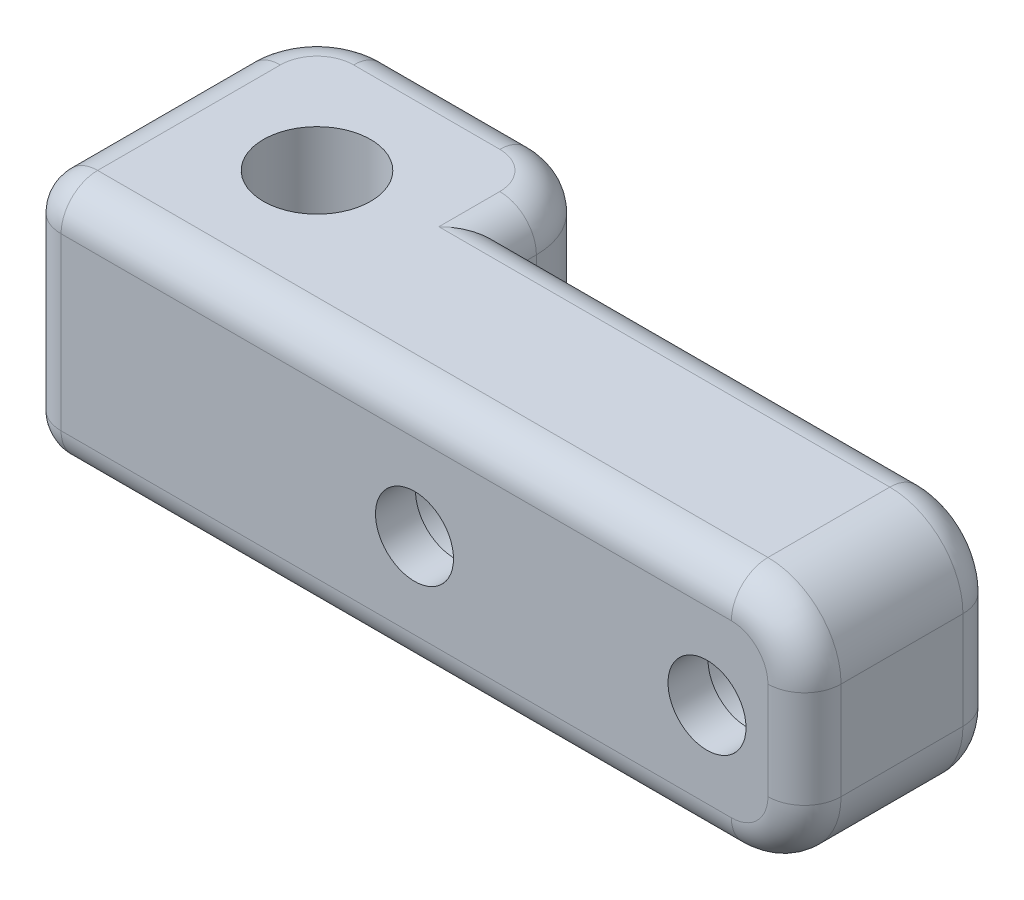
ISO-10303-21;
HEADER;
FILE_DESCRIPTION(('STEP AP214'),'2;1');
FILE_NAME('part.step','',(''),(''),'','','');
FILE_SCHEMA(('AUTOMOTIVE_DESIGN { 1 0 10303 214 1 1 1 1 }'));
ENDSEC;
DATA;
#1=APPLICATION_CONTEXT('core data for automotive mechanical design processes');
#2=APPLICATION_PROTOCOL_DEFINITION('international standard','automotive_design',2000,#1);
#3=PRODUCT_CONTEXT('',#1,'mechanical');
#4=PRODUCT('Part','Part','',(#3));
#5=PRODUCT_RELATED_PRODUCT_CATEGORY('part','',(#4));
#6=PRODUCT_DEFINITION_FORMATION('','',#4);
#7=PRODUCT_DEFINITION_CONTEXT('part definition',#1,'design');
#8=PRODUCT_DEFINITION('design','',#6,#7);
#9=PRODUCT_DEFINITION_SHAPE('','',#8);
#10=(LENGTH_UNIT() NAMED_UNIT(*) SI_UNIT(.MILLI.,.METRE.));
#11=(NAMED_UNIT(*) PLANE_ANGLE_UNIT() SI_UNIT($,.RADIAN.));
#12=(NAMED_UNIT(*) SI_UNIT($,.STERADIAN.) SOLID_ANGLE_UNIT());
#13=UNCERTAINTY_MEASURE_WITH_UNIT(LENGTH_MEASURE(1.E-05),#10,'distance_accuracy_value','');
#14=(GEOMETRIC_REPRESENTATION_CONTEXT(3) GLOBAL_UNCERTAINTY_ASSIGNED_CONTEXT((#13)) GLOBAL_UNIT_ASSIGNED_CONTEXT((#10,
#11,#12)) REPRESENTATION_CONTEXT('',''));
#15=CARTESIAN_POINT('',(0.,0.,0.));
#16=DIRECTION('',(0.,0.,1.));
#17=DIRECTION('',(1.,0.,0.));
#18=AXIS2_PLACEMENT_3D('',#15,#16,#17);
#19=CARTESIAN_POINT('',(12.,10.,0.));
#20=DIRECTION('',(-1.,0.,0.));
#21=DIRECTION('',(0.,0.,1.));
#22=AXIS2_PLACEMENT_3D('',#19,#20,#21);
#23=PLANE('',#22);
#24=DIRECTION('',(0.,1.,0.));
#25=VECTOR('',#24,1.);
#26=CARTESIAN_POINT('',(12.,10.,-8.));
#27=LINE('',#26,#25);
#28=CARTESIAN_POINT('',(12.,1.5,-8.));
#29=VERTEX_POINT('',#28);
#30=CARTESIAN_POINT('',(12.,8.5,-8.));
#31=VERTEX_POINT('',#30);
#32=EDGE_CURVE('E212',#29,#31,#27,.T.);
#33=ORIENTED_EDGE('',*,*,#32,.F.);
#34=DIRECTION('',(0.,0.,-1.));
#35=VECTOR('',#34,1.);
#36=CARTESIAN_POINT('',(12.,1.5,-9.));
#37=LINE('',#36,#35);
#38=CARTESIAN_POINT('',(12.,1.5,-9.));
#39=VERTEX_POINT('',#38);
#40=EDGE_CURVE('E187',#29,#39,#37,.T.);
#41=ORIENTED_EDGE('',*,*,#40,.T.);
#42=DIRECTION('',(0.,-1.,0.));
#43=VECTOR('',#42,1.);
#44=CARTESIAN_POINT('',(12.,10.,-9.));
#45=LINE('',#44,#43);
#46=CARTESIAN_POINT('',(12.,8.5,-9.));
#47=VERTEX_POINT('',#46);
#48=EDGE_CURVE('E209',#39,#47,#45,.F.);
#49=ORIENTED_EDGE('',*,*,#48,.T.);
#50=DIRECTION('',(0.,0.,-1.));
#51=VECTOR('',#50,1.);
#52=CARTESIAN_POINT('',(12.,8.5,0.));
#53=LINE('',#52,#51);
#54=EDGE_CURVE('E215',#47,#31,#53,.F.);
#55=ORIENTED_EDGE('',*,*,#54,.T.);
#56=EDGE_LOOP('',(#33,#41,#49,#55));
#57=FACE_BOUND('',#56,.T.);
#58=ADVANCED_FACE('F40',(#57),#23,.F.);
#59=CARTESIAN_POINT('',(0.,10.,0.));
#60=DIRECTION('',(1.,0.,0.));
#61=DIRECTION('',(0.,0.,-1.));
#62=AXIS2_PLACEMENT_3D('',#59,#60,#61);
#63=PLANE('',#62);
#64=DIRECTION('',(0.,-1.,0.));
#65=VECTOR('',#64,1.);
#66=CARTESIAN_POINT('',(0.,10.,-9.));
#67=LINE('',#66,#65);
#68=CARTESIAN_POINT('',(0.,8.5,-9.));
#69=VERTEX_POINT('',#68);
#70=CARTESIAN_POINT('',(0.,1.5,-9.));
#71=VERTEX_POINT('',#70);
#72=EDGE_CURVE('E401',#69,#71,#67,.T.);
#73=ORIENTED_EDGE('',*,*,#72,.T.);
#74=DIRECTION('',(0.,0.,1.));
#75=VECTOR('',#74,1.);
#76=CARTESIAN_POINT('',(0.,1.5,0.));
#77=LINE('',#76,#75);
#78=CARTESIAN_POINT('',(0.,1.5,-1.5));
#79=VERTEX_POINT('',#78);
#80=EDGE_CURVE('E11',#71,#79,#77,.T.);
#81=ORIENTED_EDGE('',*,*,#80,.T.);
#82=DIRECTION('',(0.,-1.,0.));
#83=VECTOR('',#82,1.);
#84=CARTESIAN_POINT('',(0.,10.,-1.5));
#85=LINE('',#84,#83);
#86=CARTESIAN_POINT('',(0.,8.5,-1.5));
#87=VERTEX_POINT('',#86);
#88=EDGE_CURVE('E56',#79,#87,#85,.F.);
#89=ORIENTED_EDGE('',*,*,#88,.T.);
#90=DIRECTION('',(0.,0.,1.));
#91=VECTOR('',#90,1.);
#92=CARTESIAN_POINT('',(0.,8.5,0.));
#93=LINE('',#92,#91);
#94=EDGE_CURVE('E49',#87,#69,#93,.F.);
#95=ORIENTED_EDGE('',*,*,#94,.T.);
#96=EDGE_LOOP('',(#73,#81,#89,#95));
#97=FACE_BOUND('',#96,.T.);
#98=ADVANCED_FACE('F451',(#97),#63,.F.);
#99=CARTESIAN_POINT('',(0.,10.,0.));
#100=DIRECTION('',(0.,0.,-1.));
#101=DIRECTION('',(-1.,0.,0.));
#102=AXIS2_PLACEMENT_3D('',#99,#100,#101);
#103=PLANE('',#102);
#104=DIRECTION('',(0.,-1.,0.));
#105=VECTOR('',#104,1.);
#106=CARTESIAN_POINT('',(1.5,10.,0.));
#107=LINE('',#106,#105);
#108=CARTESIAN_POINT('',(1.5,8.5,0.));
#109=VERTEX_POINT('',#108);
#110=CARTESIAN_POINT('',(1.5,1.5,0.));
#111=VERTEX_POINT('',#110);
#112=EDGE_CURVE('E299',#109,#111,#107,.T.);
#113=ORIENTED_EDGE('',*,*,#112,.T.);
#114=DIRECTION('',(1.,0.,0.));
#115=VECTOR('',#114,1.);
#116=CARTESIAN_POINT('',(29.,1.5,0.));
#117=LINE('',#116,#115);
#118=CARTESIAN_POINT('',(29.,1.5,0.));
#119=VERTEX_POINT('',#118);
#120=EDGE_CURVE('E309',#111,#119,#117,.T.);
#121=ORIENTED_EDGE('',*,*,#120,.T.);
#122=CARTESIAN_POINT('',(29.,3.,0.));
#123=DIRECTION('',(0.,0.,-1.));
#124=DIRECTION('',(-1.,0.,0.));
#125=AXIS2_PLACEMENT_3D('',#122,#123,#124);
#126=CIRCLE('',#125,1.5);
#127=CARTESIAN_POINT('',(30.5,3.,0.));
#128=VERTEX_POINT('',#127);
#129=EDGE_CURVE('E307',#119,#128,#126,.F.);
#130=ORIENTED_EDGE('',*,*,#129,.T.);
#131=DIRECTION('',(0.,-1.,0.));
#132=VECTOR('',#131,1.);
#133=CARTESIAN_POINT('',(30.5,7.,0.));
#134=LINE('',#133,#132);
#135=CARTESIAN_POINT('',(30.5,7.,0.));
#136=VERTEX_POINT('',#135);
#137=EDGE_CURVE('E305',#128,#136,#134,.F.);
#138=ORIENTED_EDGE('',*,*,#137,.T.);
#139=CARTESIAN_POINT('',(29.,7.,0.));
#140=DIRECTION('',(0.,0.,-1.));
#141=DIRECTION('',(-1.,0.,0.));
#142=AXIS2_PLACEMENT_3D('',#139,#140,#141);
#143=CIRCLE('',#142,1.5);
#144=CARTESIAN_POINT('',(29.,8.5,0.));
#145=VERTEX_POINT('',#144);
#146=EDGE_CURVE('E303',#136,#145,#143,.F.);
#147=ORIENTED_EDGE('',*,*,#146,.T.);
#148=DIRECTION('',(1.,0.,0.));
#149=VECTOR('',#148,1.);
#150=CARTESIAN_POINT('',(0.,8.5,0.));
#151=LINE('',#150,#149);
#152=EDGE_CURVE('E301',#145,#109,#151,.F.);
#153=ORIENTED_EDGE('',*,*,#152,.T.);
#154=EDGE_LOOP('',(#113,#121,#130,#138,#147,#153));
#155=FACE_BOUND('',#154,.T.);
#156=CARTESIAN_POINT('',(28.,5.,0.));
#157=DIRECTION('',(0.,0.,1.));
#158=DIRECTION('',(1.,0.,0.));
#159=AXIS2_PLACEMENT_3D('',#156,#157,#158);
#160=CIRCLE('',#159,1.59999999999999);
#161=CARTESIAN_POINT('',(29.6,5.,0.));
#162=VERTEX_POINT('',#161);
#163=EDGE_CURVE('E235',#162,#162,#160,.T.);
#164=ORIENTED_EDGE('',*,*,#163,.F.);
#165=EDGE_LOOP('',(#164));
#166=FACE_BOUND('',#165,.T.);
#167=CARTESIAN_POINT('',(16.,5.,0.));
#168=DIRECTION('',(0.,0.,1.));
#169=DIRECTION('',(1.,0.,0.));
#170=AXIS2_PLACEMENT_3D('',#167,#168,#169);
#171=CIRCLE('',#170,1.59999999999999);
#172=CARTESIAN_POINT('',(17.6,5.,0.));
#173=VERTEX_POINT('',#172);
#174=EDGE_CURVE('E397',#173,#173,#171,.T.);
#175=ORIENTED_EDGE('',*,*,#174,.F.);
#176=EDGE_LOOP('',(#175));
#177=FACE_BOUND('',#176,.T.);
#178=ADVANCED_FACE('F514',(#155,#166,#177),#103,.F.);
#179=CARTESIAN_POINT('',(0.,10.,-12.));
#180=DIRECTION('',(0.,0.,1.));
#181=DIRECTION('',(1.,0.,0.));
#182=AXIS2_PLACEMENT_3D('',#179,#180,#181);
#183=PLANE('',#182);
#184=DIRECTION('',(0.,-1.,0.));
#185=VECTOR('',#184,1.);
#186=CARTESIAN_POINT('',(9.,10.,-12.));
#187=LINE('',#186,#185);
#188=CARTESIAN_POINT('',(9.,8.5,-12.));
#189=VERTEX_POINT('',#188);
#190=CARTESIAN_POINT('',(9.,1.5,-12.));
#191=VERTEX_POINT('',#190);
#192=EDGE_CURVE('E406',#189,#191,#187,.T.);
#193=ORIENTED_EDGE('',*,*,#192,.T.);
#194=DIRECTION('',(-1.,0.,0.));
#195=VECTOR('',#194,1.);
#196=CARTESIAN_POINT('',(3.,1.5,-12.));
#197=LINE('',#196,#195);
#198=CARTESIAN_POINT('',(3.,1.5,-12.));
#199=VERTEX_POINT('',#198);
#200=EDGE_CURVE('E257',#191,#199,#197,.T.);
#201=ORIENTED_EDGE('',*,*,#200,.T.);
#202=DIRECTION('',(0.,-1.,0.));
#203=VECTOR('',#202,1.);
#204=CARTESIAN_POINT('',(3.,10.,-12.));
#205=LINE('',#204,#203);
#206=CARTESIAN_POINT('',(3.,8.5,-12.));
#207=VERTEX_POINT('',#206);
#208=EDGE_CURVE('E226',#199,#207,#205,.F.);
#209=ORIENTED_EDGE('',*,*,#208,.T.);
#210=DIRECTION('',(-1.,0.,0.));
#211=VECTOR('',#210,1.);
#212=CARTESIAN_POINT('',(0.,8.5,-12.));
#213=LINE('',#212,#211);
#214=EDGE_CURVE('E203',#207,#189,#213,.F.);
#215=ORIENTED_EDGE('',*,*,#214,.T.);
#216=EDGE_LOOP('',(#193,#201,#209,#215));
#217=FACE_BOUND('',#216,.T.);
#218=ADVANCED_FACE('F410',(#217),#183,.F.);
#219=CARTESIAN_POINT('',(0.,10.,0.));
#220=DIRECTION('',(0.,-1.,0.));
#221=DIRECTION('',(0.,0.,-1.));
#222=AXIS2_PLACEMENT_3D('',#219,#220,#221);
#223=PLANE('',#222);
#224=CARTESIAN_POINT('',(6.,10.,-6.));
#225=DIRECTION('',(0.,1.,0.));
#226=DIRECTION('',(0.,0.,1.));
#227=AXIS2_PLACEMENT_3D('',#224,#225,#226);
#228=CIRCLE('',#227,2.20000000000001);
#229=CARTESIAN_POINT('',(6.,10.,-3.79999999999999));
#230=VERTEX_POINT('',#229);
#231=EDGE_CURVE('E939',#230,#230,#228,.T.);
#232=ORIENTED_EDGE('',*,*,#231,.F.);
#233=EDGE_LOOP('',(#232));
#234=FACE_BOUND('',#233,.T.);
#235=DIRECTION('',(0.,0.,1.));
#236=VECTOR('',#235,1.);
#237=CARTESIAN_POINT('',(29.,10.,-8.));
#238=LINE('',#237,#236);
#239=CARTESIAN_POINT('',(29.,10.,-1.5));
#240=VERTEX_POINT('',#239);
#241=CARTESIAN_POINT('',(29.,10.,-6.5));
#242=VERTEX_POINT('',#241);
#243=EDGE_CURVE('E220',#240,#242,#238,.F.);
#244=ORIENTED_EDGE('',*,*,#243,.T.);
#245=DIRECTION('',(-1.,0.,0.));
#246=VECTOR('',#245,1.);
#247=CARTESIAN_POINT('',(0.,10.,-6.5));
#248=LINE('',#247,#246);
#249=CARTESIAN_POINT('',(10.5,10.,-6.5));
#250=VERTEX_POINT('',#249);
#251=EDGE_CURVE('E297',#242,#250,#248,.T.);
#252=ORIENTED_EDGE('',*,*,#251,.T.);
#253=DIRECTION('',(0.,0.,-1.));
#254=VECTOR('',#253,1.);
#255=CARTESIAN_POINT('',(10.5,10.,0.));
#256=LINE('',#255,#254);
#257=CARTESIAN_POINT('',(10.5,10.,-9.));
#258=VERTEX_POINT('',#257);
#259=EDGE_CURVE('E295',#250,#258,#256,.T.);
#260=ORIENTED_EDGE('',*,*,#259,.T.);
#261=CARTESIAN_POINT('',(9.,10.,-9.));
#262=DIRECTION('',(0.,-1.,0.));
#263=DIRECTION('',(0.,0.,-1.));
#264=AXIS2_PLACEMENT_3D('',#261,#262,#263);
#265=CIRCLE('',#264,1.5);
#266=CARTESIAN_POINT('',(9.,10.,-10.5));
#267=VERTEX_POINT('',#266);
#268=EDGE_CURVE('E293',#258,#267,#265,.F.);
#269=ORIENTED_EDGE('',*,*,#268,.T.);
#270=DIRECTION('',(-1.,0.,0.));
#271=VECTOR('',#270,1.);
#272=CARTESIAN_POINT('',(0.,10.,-10.5));
#273=LINE('',#272,#271);
#274=CARTESIAN_POINT('',(3.,10.,-10.5));
#275=VERTEX_POINT('',#274);
#276=EDGE_CURVE('E291',#267,#275,#273,.T.);
#277=ORIENTED_EDGE('',*,*,#276,.T.);
#278=CARTESIAN_POINT('',(3.,10.,-9.));
#279=DIRECTION('',(0.,-1.,0.));
#280=DIRECTION('',(0.,0.,-1.));
#281=AXIS2_PLACEMENT_3D('',#278,#279,#280);
#282=CIRCLE('',#281,1.5);
#283=CARTESIAN_POINT('',(1.5,10.,-9.));
#284=VERTEX_POINT('',#283);
#285=EDGE_CURVE('E289',#275,#284,#282,.F.);
#286=ORIENTED_EDGE('',*,*,#285,.T.);
#287=DIRECTION('',(0.,0.,1.));
#288=VECTOR('',#287,1.);
#289=CARTESIAN_POINT('',(1.5,10.,0.));
#290=LINE('',#289,#288);
#291=CARTESIAN_POINT('',(1.5,10.,-1.5));
#292=VERTEX_POINT('',#291);
#293=EDGE_CURVE('E287',#284,#292,#290,.T.);
#294=ORIENTED_EDGE('',*,*,#293,.T.);
#295=DIRECTION('',(1.,0.,0.));
#296=VECTOR('',#295,1.);
#297=CARTESIAN_POINT('',(0.,10.,-1.5));
#298=LINE('',#297,#296);
#299=EDGE_CURVE('E285',#292,#240,#298,.T.);
#300=ORIENTED_EDGE('',*,*,#299,.T.);
#301=EDGE_LOOP('',(#244,#252,#260,#269,#277,#286,#294,#300));
#302=FACE_BOUND('',#301,.T.);
#303=ADVANCED_FACE('F473',(#234,#302),#223,.F.);
#304=CARTESIAN_POINT('',(0.,0.,0.));
#305=DIRECTION('',(0.,-1.,0.));
#306=DIRECTION('',(0.,0.,-1.));
#307=AXIS2_PLACEMENT_3D('',#304,#305,#306);
#308=PLANE('',#307);
#309=CARTESIAN_POINT('',(6.,0.,-6.));
#310=DIRECTION('',(0.,-1.,0.));
#311=DIRECTION('',(0.,0.,-1.));
#312=AXIS2_PLACEMENT_3D('',#309,#310,#311);
#313=CIRCLE('',#312,1.60000000000001);
#314=CARTESIAN_POINT('',(6.,0.,-7.60000000000001));
#315=VERTEX_POINT('',#314);
#316=EDGE_CURVE('E44',#315,#315,#313,.T.);
#317=ORIENTED_EDGE('',*,*,#316,.F.);
#318=EDGE_LOOP('',(#317));
#319=FACE_BOUND('',#318,.T.);
#320=DIRECTION('',(0.,0.,-1.));
#321=VECTOR('',#320,1.);
#322=CARTESIAN_POINT('',(10.5,0.,-8.));
#323=LINE('',#322,#321);
#324=CARTESIAN_POINT('',(10.5,0.,-9.));
#325=VERTEX_POINT('',#324);
#326=CARTESIAN_POINT('',(10.5,0.,-6.5));
#327=VERTEX_POINT('',#326);
#328=EDGE_CURVE('E189',#325,#327,#323,.F.);
#329=ORIENTED_EDGE('',*,*,#328,.T.);
#330=DIRECTION('',(-1.,0.,0.));
#331=VECTOR('',#330,1.);
#332=CARTESIAN_POINT('',(29.,0.,-6.5));
#333=LINE('',#332,#331);
#334=CARTESIAN_POINT('',(29.,0.,-6.5));
#335=VERTEX_POINT('',#334);
#336=EDGE_CURVE('E253',#327,#335,#333,.F.);
#337=ORIENTED_EDGE('',*,*,#336,.T.);
#338=DIRECTION('',(0.,0.,-1.));
#339=VECTOR('',#338,1.);
#340=CARTESIAN_POINT('',(29.,0.,0.));
#341=LINE('',#340,#339);
#342=CARTESIAN_POINT('',(29.,0.,-1.5));
#343=VERTEX_POINT('',#342);
#344=EDGE_CURVE('E403',#335,#343,#341,.F.);
#345=ORIENTED_EDGE('',*,*,#344,.T.);
#346=DIRECTION('',(1.,0.,0.));
#347=VECTOR('',#346,1.);
#348=CARTESIAN_POINT('',(0.,0.,-1.5));
#349=LINE('',#348,#347);
#350=CARTESIAN_POINT('',(1.5,0.,-1.5));
#351=VERTEX_POINT('',#350);
#352=EDGE_CURVE('E244',#343,#351,#349,.F.);
#353=ORIENTED_EDGE('',*,*,#352,.T.);
#354=DIRECTION('',(0.,0.,1.));
#355=VECTOR('',#354,1.);
#356=CARTESIAN_POINT('',(1.5,0.,-9.));
#357=LINE('',#356,#355);
#358=CARTESIAN_POINT('',(1.5,0.,-9.));
#359=VERTEX_POINT('',#358);
#360=EDGE_CURVE('E214',#351,#359,#357,.F.);
#361=ORIENTED_EDGE('',*,*,#360,.T.);
#362=CARTESIAN_POINT('',(3.,0.,-9.));
#363=DIRECTION('',(0.,-1.,0.));
#364=DIRECTION('',(0.,0.,-1.));
#365=AXIS2_PLACEMENT_3D('',#362,#363,#364);
#366=CIRCLE('',#365,1.5);
#367=CARTESIAN_POINT('',(3.,0.,-10.5));
#368=VERTEX_POINT('',#367);
#369=EDGE_CURVE('E246',#359,#368,#366,.T.);
#370=ORIENTED_EDGE('',*,*,#369,.T.);
#371=DIRECTION('',(-1.,0.,0.));
#372=VECTOR('',#371,1.);
#373=CARTESIAN_POINT('',(9.,0.,-10.5));
#374=LINE('',#373,#372);
#375=CARTESIAN_POINT('',(9.,0.,-10.5));
#376=VERTEX_POINT('',#375);
#377=EDGE_CURVE('E248',#368,#376,#374,.F.);
#378=ORIENTED_EDGE('',*,*,#377,.T.);
#379=CARTESIAN_POINT('',(9.,0.,-9.));
#380=DIRECTION('',(0.,-1.,0.));
#381=DIRECTION('',(0.,0.,-1.));
#382=AXIS2_PLACEMENT_3D('',#379,#380,#381);
#383=CIRCLE('',#382,1.5);
#384=EDGE_CURVE('E250',#376,#325,#383,.T.);
#385=ORIENTED_EDGE('',*,*,#384,.T.);
#386=EDGE_LOOP('',(#329,#337,#345,#353,#361,#370,#378,#385));
#387=FACE_BOUND('',#386,.T.);
#388=ADVANCED_FACE('F440',(#319,#387),#308,.T.);
#389=CARTESIAN_POINT('',(32.,10.,-8.));
#390=DIRECTION('',(0.,0.,1.));
#391=DIRECTION('',(0.,-1.,0.));
#392=AXIS2_PLACEMENT_3D('',#389,#390,#391);
#393=PLANE('',#392);
#394=CARTESIAN_POINT('',(28.,5.,-8.));
#395=DIRECTION('',(0.,0.,-1.));
#396=DIRECTION('',(0.,1.,0.));
#397=AXIS2_PLACEMENT_3D('',#394,#395,#396);
#398=CIRCLE('',#397,2.19999999999999);
#399=CARTESIAN_POINT('',(28.,7.19999999999999,-8.));
#400=VERTEX_POINT('',#399);
#401=EDGE_CURVE('E376',#400,#400,#398,.T.);
#402=ORIENTED_EDGE('',*,*,#401,.F.);
#403=EDGE_LOOP('',(#402));
#404=FACE_BOUND('',#403,.T.);
#405=CARTESIAN_POINT('',(16.,5.,-8.));
#406=DIRECTION('',(0.,0.,-1.));
#407=DIRECTION('',(0.,1.,0.));
#408=AXIS2_PLACEMENT_3D('',#405,#406,#407);
#409=CIRCLE('',#408,2.19999999999999);
#410=CARTESIAN_POINT('',(16.,7.19999999999999,-8.));
#411=VERTEX_POINT('',#410);
#412=EDGE_CURVE('E240',#411,#411,#409,.T.);
#413=ORIENTED_EDGE('',*,*,#412,.F.);
#414=EDGE_LOOP('',(#413));
#415=FACE_BOUND('',#414,.T.);
#416=CARTESIAN_POINT('',(29.,3.,-8.));
#417=DIRECTION('',(0.,0.,1.));
#418=DIRECTION('',(0.,-1.,0.));
#419=AXIS2_PLACEMENT_3D('',#416,#417,#418);
#420=CIRCLE('',#419,1.5);
#421=CARTESIAN_POINT('',(30.5,3.,-8.));
#422=VERTEX_POINT('',#421);
#423=CARTESIAN_POINT('',(29.,1.5,-8.));
#424=VERTEX_POINT('',#423);
#425=EDGE_CURVE('E269',#422,#424,#420,.F.);
#426=ORIENTED_EDGE('',*,*,#425,.T.);
#427=DIRECTION('',(-1.,0.,0.));
#428=VECTOR('',#427,1.);
#429=CARTESIAN_POINT('',(12.,1.5,-8.));
#430=LINE('',#429,#428);
#431=EDGE_CURVE('E271',#424,#29,#430,.T.);
#432=ORIENTED_EDGE('',*,*,#431,.T.);
#433=ORIENTED_EDGE('',*,*,#32,.T.);
#434=DIRECTION('',(-1.,0.,0.));
#435=VECTOR('',#434,1.);
#436=CARTESIAN_POINT('',(32.,8.5,-8.));
#437=LINE('',#436,#435);
#438=CARTESIAN_POINT('',(29.,8.5,-8.));
#439=VERTEX_POINT('',#438);
#440=EDGE_CURVE('E263',#31,#439,#437,.F.);
#441=ORIENTED_EDGE('',*,*,#440,.T.);
#442=CARTESIAN_POINT('',(29.,7.,-8.));
#443=DIRECTION('',(0.,0.,1.));
#444=DIRECTION('',(0.,-1.,0.));
#445=AXIS2_PLACEMENT_3D('',#442,#443,#444);
#446=CIRCLE('',#445,1.5);
#447=CARTESIAN_POINT('',(30.5,7.,-8.));
#448=VERTEX_POINT('',#447);
#449=EDGE_CURVE('E265',#439,#448,#446,.F.);
#450=ORIENTED_EDGE('',*,*,#449,.T.);
#451=DIRECTION('',(0.,1.,0.));
#452=VECTOR('',#451,1.);
#453=CARTESIAN_POINT('',(30.5,3.,-8.));
#454=LINE('',#453,#452);
#455=EDGE_CURVE('E267',#448,#422,#454,.F.);
#456=ORIENTED_EDGE('',*,*,#455,.T.);
#457=EDGE_LOOP('',(#426,#432,#433,#441,#450,#456));
#458=FACE_BOUND('',#457,.T.);
#459=ADVANCED_FACE('F430',(#404,#415,#458),#393,.F.);
#460=CARTESIAN_POINT('',(32.,0.,0.));
#461=DIRECTION('',(1.,0.,0.));
#462=DIRECTION('',(0.,0.,-1.));
#463=AXIS2_PLACEMENT_3D('',#460,#461,#462);
#464=PLANE('',#463);
#465=DIRECTION('',(0.,0.,-1.));
#466=VECTOR('',#465,1.);
#467=CARTESIAN_POINT('',(32.,3.,0.));
#468=LINE('',#467,#466);
#469=CARTESIAN_POINT('',(32.,3.,-1.5));
#470=VERTEX_POINT('',#469);
#471=CARTESIAN_POINT('',(32.,3.,-6.5));
#472=VERTEX_POINT('',#471);
#473=EDGE_CURVE('E223',#470,#472,#468,.T.);
#474=ORIENTED_EDGE('',*,*,#473,.T.);
#475=DIRECTION('',(0.,1.,0.));
#476=VECTOR('',#475,1.);
#477=CARTESIAN_POINT('',(32.,7.,-6.5));
#478=LINE('',#477,#476);
#479=CARTESIAN_POINT('',(32.,7.,-6.5));
#480=VERTEX_POINT('',#479);
#481=EDGE_CURVE('E279',#472,#480,#478,.T.);
#482=ORIENTED_EDGE('',*,*,#481,.T.);
#483=DIRECTION('',(0.,0.,1.));
#484=VECTOR('',#483,1.);
#485=CARTESIAN_POINT('',(32.,7.,0.));
#486=LINE('',#485,#484);
#487=CARTESIAN_POINT('',(32.,7.,-1.5));
#488=VERTEX_POINT('',#487);
#489=EDGE_CURVE('E219',#480,#488,#486,.T.);
#490=ORIENTED_EDGE('',*,*,#489,.T.);
#491=DIRECTION('',(0.,-1.,0.));
#492=VECTOR('',#491,1.);
#493=CARTESIAN_POINT('',(32.,3.,-1.5));
#494=LINE('',#493,#492);
#495=EDGE_CURVE('E277',#488,#470,#494,.T.);
#496=ORIENTED_EDGE('',*,*,#495,.T.);
#497=EDGE_LOOP('',(#474,#482,#490,#496));
#498=FACE_BOUND('',#497,.T.);
#499=ADVANCED_FACE('F490',(#498),#464,.T.);
#500=CARTESIAN_POINT('',(16.,5.,0.));
#501=DIRECTION('',(0.,0.,1.));
#502=DIRECTION('',(1.,0.,0.));
#503=AXIS2_PLACEMENT_3D('',#500,#501,#502);
#504=CYLINDRICAL_SURFACE('',#503,1.59999999999999);
#505=CARTESIAN_POINT('',(16.,5.,-1.63948362858346));
#506=DIRECTION('',(0.,0.,-1.));
#507=DIRECTION('',(0.,1.,0.));
#508=AXIS2_PLACEMENT_3D('',#505,#506,#507);
#509=CIRCLE('',#508,1.59999999999999);
#510=CARTESIAN_POINT('',(16.,6.59999999999999,-1.63948362858346));
#511=VERTEX_POINT('',#510);
#512=EDGE_CURVE('E232',#511,#511,#509,.T.);
#513=ORIENTED_EDGE('',*,*,#512,.T.);
#514=EDGE_LOOP('',(#513));
#515=FACE_BOUND('',#514,.T.);
#516=ORIENTED_EDGE('',*,*,#174,.T.);
#517=EDGE_LOOP('',(#516));
#518=FACE_BOUND('',#517,.T.);
#519=ADVANCED_FACE('F843',(#515,#518),#504,.F.);
#520=CARTESIAN_POINT('',(28.,5.,0.));
#521=DIRECTION('',(0.,0.,1.));
#522=DIRECTION('',(1.,0.,0.));
#523=AXIS2_PLACEMENT_3D('',#520,#521,#522);
#524=CYLINDRICAL_SURFACE('',#523,1.59999999999999);
#525=CARTESIAN_POINT('',(28.,5.,-1.63948362858346));
#526=DIRECTION('',(0.,0.,-1.));
#527=DIRECTION('',(0.,1.,0.));
#528=AXIS2_PLACEMENT_3D('',#525,#526,#527);
#529=CIRCLE('',#528,1.59999999999999);
#530=CARTESIAN_POINT('',(28.,6.59999999999999,-1.63948362858346));
#531=VERTEX_POINT('',#530);
#532=EDGE_CURVE('E237',#531,#531,#529,.T.);
#533=ORIENTED_EDGE('',*,*,#532,.T.);
#534=EDGE_LOOP('',(#533));
#535=FACE_BOUND('',#534,.T.);
#536=ORIENTED_EDGE('',*,*,#163,.T.);
#537=EDGE_LOOP('',(#536));
#538=FACE_BOUND('',#537,.T.);
#539=ADVANCED_FACE('F541',(#535,#538),#524,.F.);
#540=CARTESIAN_POINT('',(3.,10.,-9.));
#541=DIRECTION('',(0.,-1.,0.));
#542=DIRECTION('',(0.,0.,-1.));
#543=AXIS2_PLACEMENT_3D('',#540,#541,#542);
#544=CYLINDRICAL_SURFACE('',#543,3.);
#545=ORIENTED_EDGE('',*,*,#208,.F.);
#546=CARTESIAN_POINT('',(3.,1.5,-9.));
#547=DIRECTION('',(0.,-1.,0.));
#548=DIRECTION('',(0.,0.,-1.));
#549=AXIS2_PLACEMENT_3D('',#546,#547,#548);
#550=CIRCLE('',#549,3.);
#551=EDGE_CURVE('E261',#199,#71,#550,.F.);
#552=ORIENTED_EDGE('',*,*,#551,.T.);
#553=ORIENTED_EDGE('',*,*,#72,.F.);
#554=CARTESIAN_POINT('',(3.,8.5,-9.));
#555=DIRECTION('',(0.,-1.,0.));
#556=DIRECTION('',(0.,0.,-1.));
#557=AXIS2_PLACEMENT_3D('',#554,#555,#556);
#558=CIRCLE('',#557,3.);
#559=EDGE_CURVE('E259',#69,#207,#558,.T.);
#560=ORIENTED_EDGE('',*,*,#559,.T.);
#561=EDGE_LOOP('',(#545,#552,#553,#560));
#562=FACE_BOUND('',#561,.T.);
#563=ADVANCED_FACE('F450',(#562),#544,.T.);
#564=CARTESIAN_POINT('',(9.,10.,-9.));
#565=DIRECTION('',(0.,-1.,0.));
#566=DIRECTION('',(0.,0.,-1.));
#567=AXIS2_PLACEMENT_3D('',#564,#565,#566);
#568=CYLINDRICAL_SURFACE('',#567,3.);
#569=ORIENTED_EDGE('',*,*,#48,.F.);
#570=CARTESIAN_POINT('',(9.,1.5,-9.));
#571=DIRECTION('',(0.,-1.,0.));
#572=DIRECTION('',(0.,0.,-1.));
#573=AXIS2_PLACEMENT_3D('',#570,#571,#572);
#574=CIRCLE('',#573,3.);
#575=EDGE_CURVE('E195',#39,#191,#574,.F.);
#576=ORIENTED_EDGE('',*,*,#575,.T.);
#577=ORIENTED_EDGE('',*,*,#192,.F.);
#578=CARTESIAN_POINT('',(9.,8.5,-9.));
#579=DIRECTION('',(0.,-1.,0.));
#580=DIRECTION('',(0.,0.,-1.));
#581=AXIS2_PLACEMENT_3D('',#578,#579,#580);
#582=CIRCLE('',#581,3.);
#583=EDGE_CURVE('E204',#189,#47,#582,.T.);
#584=ORIENTED_EDGE('',*,*,#583,.T.);
#585=EDGE_LOOP('',(#569,#576,#577,#584));
#586=FACE_BOUND('',#585,.T.);
#587=ADVANCED_FACE('F217',(#586),#568,.T.);
#588=CARTESIAN_POINT('',(29.,3.,0.));
#589=DIRECTION('',(0.,0.,-1.));
#590=DIRECTION('',(-1.,0.,0.));
#591=AXIS2_PLACEMENT_3D('',#588,#589,#590);
#592=CYLINDRICAL_SURFACE('',#591,3.);
#593=ORIENTED_EDGE('',*,*,#344,.F.);
#594=CARTESIAN_POINT('',(29.,3.,-6.5));
#595=DIRECTION('',(0.,0.,1.));
#596=DIRECTION('',(0.,-1.,0.));
#597=AXIS2_PLACEMENT_3D('',#594,#595,#596);
#598=CIRCLE('',#597,3.);
#599=EDGE_CURVE('E275',#335,#472,#598,.T.);
#600=ORIENTED_EDGE('',*,*,#599,.T.);
#601=ORIENTED_EDGE('',*,*,#473,.F.);
#602=CARTESIAN_POINT('',(29.,3.,-1.5));
#603=DIRECTION('',(0.,0.,-1.));
#604=DIRECTION('',(-1.,0.,0.));
#605=AXIS2_PLACEMENT_3D('',#602,#603,#604);
#606=CIRCLE('',#605,3.);
#607=EDGE_CURVE('E273',#470,#343,#606,.T.);
#608=ORIENTED_EDGE('',*,*,#607,.T.);
#609=EDGE_LOOP('',(#593,#600,#601,#608));
#610=FACE_BOUND('',#609,.T.);
#611=ADVANCED_FACE('F502',(#610),#592,.T.);
#612=CARTESIAN_POINT('',(29.,7.,0.));
#613=DIRECTION('',(0.,0.,-1.));
#614=DIRECTION('',(-1.,0.,0.));
#615=AXIS2_PLACEMENT_3D('',#612,#613,#614);
#616=CYLINDRICAL_SURFACE('',#615,3.);
#617=ORIENTED_EDGE('',*,*,#489,.F.);
#618=CARTESIAN_POINT('',(29.,7.,-6.5));
#619=DIRECTION('',(0.,0.,1.));
#620=DIRECTION('',(0.,-1.,0.));
#621=AXIS2_PLACEMENT_3D('',#618,#619,#620);
#622=CIRCLE('',#621,3.);
#623=EDGE_CURVE('E283',#480,#242,#622,.T.);
#624=ORIENTED_EDGE('',*,*,#623,.T.);
#625=ORIENTED_EDGE('',*,*,#243,.F.);
#626=CARTESIAN_POINT('',(29.,7.,-1.5));
#627=DIRECTION('',(0.,0.,-1.));
#628=DIRECTION('',(-1.,0.,0.));
#629=AXIS2_PLACEMENT_3D('',#626,#627,#628);
#630=CIRCLE('',#629,3.);
#631=EDGE_CURVE('E281',#240,#488,#630,.T.);
#632=ORIENTED_EDGE('',*,*,#631,.T.);
#633=EDGE_LOOP('',(#617,#624,#625,#632));
#634=FACE_BOUND('',#633,.T.);
#635=ADVANCED_FACE('F487',(#634),#616,.T.);
#636=CARTESIAN_POINT('',(16.,5.,-2.));
#637=DIRECTION('',(0.,0.,-1.));
#638=DIRECTION('',(0.,1.,0.));
#639=AXIS2_PLACEMENT_3D('',#636,#637,#638);
#640=CONICAL_SURFACE('',#639,2.2,1.02974425867665);
#641=CARTESIAN_POINT('',(16.,5.,-2.));
#642=DIRECTION('',(0.,0.,-1.));
#643=DIRECTION('',(0.,1.,0.));
#644=AXIS2_PLACEMENT_3D('',#641,#642,#643);
#645=CIRCLE('',#644,2.2);
#646=CARTESIAN_POINT('',(16.,7.2,-2.));
#647=VERTEX_POINT('',#646);
#648=EDGE_CURVE('E236',#647,#647,#645,.T.);
#649=ORIENTED_EDGE('',*,*,#648,.T.);
#650=EDGE_LOOP('',(#649));
#651=FACE_BOUND('',#650,.T.);
#652=ORIENTED_EDGE('',*,*,#512,.F.);
#653=EDGE_LOOP('',(#652));
#654=FACE_BOUND('',#653,.T.);
#655=ADVANCED_FACE('F548',(#651,#654),#640,.F.);
#656=CARTESIAN_POINT('',(16.,5.,-8.));
#657=DIRECTION('',(0.,0.,-1.));
#658=DIRECTION('',(0.,1.,0.));
#659=AXIS2_PLACEMENT_3D('',#656,#657,#658);
#660=CYLINDRICAL_SURFACE('',#659,2.2);
#661=ORIENTED_EDGE('',*,*,#648,.F.);
#662=EDGE_LOOP('',(#661));
#663=FACE_BOUND('',#662,.T.);
#664=ORIENTED_EDGE('',*,*,#412,.T.);
#665=EDGE_LOOP('',(#664));
#666=FACE_BOUND('',#665,.T.);
#667=ADVANCED_FACE('F798',(#663,#666),#660,.F.);
#668=CARTESIAN_POINT('',(28.,5.,-2.));
#669=DIRECTION('',(0.,0.,-1.));
#670=DIRECTION('',(0.,1.,0.));
#671=AXIS2_PLACEMENT_3D('',#668,#669,#670);
#672=CONICAL_SURFACE('',#671,2.2,1.02974425867665);
#673=CARTESIAN_POINT('',(28.,5.,-2.));
#674=DIRECTION('',(0.,0.,-1.));
#675=DIRECTION('',(0.,1.,0.));
#676=AXIS2_PLACEMENT_3D('',#673,#674,#675);
#677=CIRCLE('',#676,2.2);
#678=CARTESIAN_POINT('',(28.,7.2,-2.));
#679=VERTEX_POINT('',#678);
#680=EDGE_CURVE('E241',#679,#679,#677,.T.);
#681=ORIENTED_EDGE('',*,*,#680,.T.);
#682=EDGE_LOOP('',(#681));
#683=FACE_BOUND('',#682,.T.);
#684=ORIENTED_EDGE('',*,*,#532,.F.);
#685=EDGE_LOOP('',(#684));
#686=FACE_BOUND('',#685,.T.);
#687=ADVANCED_FACE('F789',(#683,#686),#672,.F.);
#688=CARTESIAN_POINT('',(28.,5.,-8.));
#689=DIRECTION('',(0.,0.,-1.));
#690=DIRECTION('',(0.,1.,0.));
#691=AXIS2_PLACEMENT_3D('',#688,#689,#690);
#692=CYLINDRICAL_SURFACE('',#691,2.19999999999999);
#693=ORIENTED_EDGE('',*,*,#680,.F.);
#694=EDGE_LOOP('',(#693));
#695=FACE_BOUND('',#694,.T.);
#696=ORIENTED_EDGE('',*,*,#401,.T.);
#697=EDGE_LOOP('',(#696));
#698=FACE_BOUND('',#697,.T.);
#699=ADVANCED_FACE('F782',(#695,#698),#692,.F.);
#700=CARTESIAN_POINT('',(3.,8.5,-9.));
#701=DIRECTION('',(0.,-1.,0.));
#702=DIRECTION('',(0.,0.,-1.));
#703=AXIS2_PLACEMENT_3D('',#700,#701,#702);
#704=DEGENERATE_TOROIDAL_SURFACE('',#703,1.5,1.5,.T.);
#705=CARTESIAN_POINT('',(1.5,8.5,-9.));
#706=DIRECTION('',(0.,0.,1.));
#707=DIRECTION('',(1.,0.,0.));
#708=AXIS2_PLACEMENT_3D('',#705,#706,#707);
#709=CIRCLE('',#708,1.5);
#710=EDGE_CURVE('E372',#284,#69,#709,.T.);
#711=ORIENTED_EDGE('',*,*,#710,.F.);
#712=ORIENTED_EDGE('',*,*,#285,.F.);
#713=CARTESIAN_POINT('',(3.,8.5,-10.5));
#714=DIRECTION('',(1.,0.,0.));
#715=DIRECTION('',(0.,0.,-1.));
#716=AXIS2_PLACEMENT_3D('',#713,#714,#715);
#717=CIRCLE('',#716,1.5);
#718=EDGE_CURVE('E374',#207,#275,#717,.T.);
#719=ORIENTED_EDGE('',*,*,#718,.F.);
#720=ORIENTED_EDGE('',*,*,#559,.F.);
#721=EDGE_LOOP('',(#711,#712,#719,#720));
#722=FACE_BOUND('',#721,.T.);
#723=ADVANCED_FACE('F42',(#722),#704,.T.);
#724=CARTESIAN_POINT('',(29.,7.,-1.5));
#725=DIRECTION('',(0.,0.,-1.));
#726=DIRECTION('',(-1.,0.,0.));
#727=AXIS2_PLACEMENT_3D('',#724,#725,#726);
#728=DEGENERATE_TOROIDAL_SURFACE('',#727,1.5,1.5,.T.);
#729=CARTESIAN_POINT('',(30.5,7.,-1.5));
#730=DIRECTION('',(0.,-1.,0.));
#731=DIRECTION('',(0.,0.,-1.));
#732=AXIS2_PLACEMENT_3D('',#729,#730,#731);
#733=CIRCLE('',#732,1.5);
#734=EDGE_CURVE('E366',#488,#136,#733,.T.);
#735=ORIENTED_EDGE('',*,*,#734,.F.);
#736=ORIENTED_EDGE('',*,*,#631,.F.);
#737=CARTESIAN_POINT('',(29.,8.5,-1.5));
#738=DIRECTION('',(-1.,0.,0.));
#739=DIRECTION('',(0.,0.,1.));
#740=AXIS2_PLACEMENT_3D('',#737,#738,#739);
#741=CIRCLE('',#740,1.5);
#742=EDGE_CURVE('E369',#145,#240,#741,.T.);
#743=ORIENTED_EDGE('',*,*,#742,.F.);
#744=ORIENTED_EDGE('',*,*,#146,.F.);
#745=EDGE_LOOP('',(#735,#736,#743,#744));
#746=FACE_BOUND('',#745,.T.);
#747=ADVANCED_FACE('F483',(#746),#728,.T.);
#748=CARTESIAN_POINT('',(0.,8.5,-10.5));
#749=DIRECTION('',(-1.,0.,0.));
#750=DIRECTION('',(0.,0.,1.));
#751=AXIS2_PLACEMENT_3D('',#748,#749,#750);
#752=CYLINDRICAL_SURFACE('',#751,1.5);
#753=ORIENTED_EDGE('',*,*,#718,.T.);
#754=ORIENTED_EDGE('',*,*,#276,.F.);
#755=CARTESIAN_POINT('',(9.,8.5,-10.5));
#756=DIRECTION('',(1.,0.,0.));
#757=DIRECTION('',(0.,0.,-1.));
#758=AXIS2_PLACEMENT_3D('',#755,#756,#757);
#759=CIRCLE('',#758,1.5);
#760=EDGE_CURVE('E363',#189,#267,#759,.T.);
#761=ORIENTED_EDGE('',*,*,#760,.F.);
#762=ORIENTED_EDGE('',*,*,#214,.F.);
#763=EDGE_LOOP('',(#753,#754,#761,#762));
#764=FACE_BOUND('',#763,.T.);
#765=ADVANCED_FACE('F419',(#764),#752,.T.);
#766=CARTESIAN_POINT('',(1.5,8.5,0.));
#767=DIRECTION('',(0.,0.,1.));
#768=DIRECTION('',(1.,0.,0.));
#769=AXIS2_PLACEMENT_3D('',#766,#767,#768);
#770=CYLINDRICAL_SURFACE('',#769,1.5);
#771=ORIENTED_EDGE('',*,*,#710,.T.);
#772=ORIENTED_EDGE('',*,*,#94,.F.);
#773=CARTESIAN_POINT('',(1.5,8.5,-1.5));
#774=DIRECTION('',(0.,0.,1.));
#775=DIRECTION('',(1.,0.,0.));
#776=AXIS2_PLACEMENT_3D('',#773,#774,#775);
#777=CIRCLE('',#776,1.5);
#778=EDGE_CURVE('E360',#292,#87,#777,.T.);
#779=ORIENTED_EDGE('',*,*,#778,.F.);
#780=ORIENTED_EDGE('',*,*,#293,.F.);
#781=EDGE_LOOP('',(#771,#772,#779,#780));
#782=FACE_BOUND('',#781,.T.);
#783=ADVANCED_FACE('F470',(#782),#770,.T.);
#784=CARTESIAN_POINT('',(0.,8.5,-1.5));
#785=DIRECTION('',(1.,0.,0.));
#786=DIRECTION('',(0.,0.,-1.));
#787=AXIS2_PLACEMENT_3D('',#784,#785,#786);
#788=CYLINDRICAL_SURFACE('',#787,1.5);
#789=ORIENTED_EDGE('',*,*,#742,.T.);
#790=ORIENTED_EDGE('',*,*,#299,.F.);
#791=CARTESIAN_POINT('',(1.5,8.5,-1.5));
#792=DIRECTION('',(-1.,0.,0.));
#793=DIRECTION('',(0.,0.,1.));
#794=AXIS2_PLACEMENT_3D('',#791,#792,#793);
#795=CIRCLE('',#794,1.5);
#796=EDGE_CURVE('E357',#109,#292,#795,.T.);
#797=ORIENTED_EDGE('',*,*,#796,.F.);
#798=ORIENTED_EDGE('',*,*,#152,.F.);
#799=EDGE_LOOP('',(#789,#790,#797,#798));
#800=FACE_BOUND('',#799,.T.);
#801=ADVANCED_FACE('F476',(#800),#788,.T.);
#802=CARTESIAN_POINT('',(30.5,0.,-1.5));
#803=DIRECTION('',(0.,1.,0.));
#804=DIRECTION('',(0.,0.,1.));
#805=AXIS2_PLACEMENT_3D('',#802,#803,#804);
#806=CYLINDRICAL_SURFACE('',#805,1.5);
#807=ORIENTED_EDGE('',*,*,#734,.T.);
#808=ORIENTED_EDGE('',*,*,#137,.F.);
#809=CARTESIAN_POINT('',(30.5,3.,-1.5));
#810=DIRECTION('',(0.,-1.,0.));
#811=DIRECTION('',(0.,0.,-1.));
#812=AXIS2_PLACEMENT_3D('',#809,#810,#811);
#813=CIRCLE('',#812,1.5);
#814=EDGE_CURVE('E354',#470,#128,#813,.T.);
#815=ORIENTED_EDGE('',*,*,#814,.F.);
#816=ORIENTED_EDGE('',*,*,#495,.F.);
#817=EDGE_LOOP('',(#807,#808,#815,#816));
#818=FACE_BOUND('',#817,.T.);
#819=ADVANCED_FACE('F518',(#818),#806,.T.);
#820=CARTESIAN_POINT('',(9.,8.5,-9.));
#821=DIRECTION('',(0.,-1.,0.));
#822=DIRECTION('',(0.,0.,-1.));
#823=AXIS2_PLACEMENT_3D('',#820,#821,#822);
#824=DEGENERATE_TOROIDAL_SURFACE('',#823,1.5,1.5,.T.);
#825=ORIENTED_EDGE('',*,*,#760,.T.);
#826=ORIENTED_EDGE('',*,*,#268,.F.);
#827=CARTESIAN_POINT('',(10.5,8.5,-9.));
#828=DIRECTION('',(0.,0.,1.));
#829=DIRECTION('',(1.,0.,0.));
#830=AXIS2_PLACEMENT_3D('',#827,#828,#829);
#831=CIRCLE('',#830,1.5);
#832=EDGE_CURVE('E351',#47,#258,#831,.T.);
#833=ORIENTED_EDGE('',*,*,#832,.F.);
#834=ORIENTED_EDGE('',*,*,#583,.F.);
#835=EDGE_LOOP('',(#825,#826,#833,#834));
#836=FACE_BOUND('',#835,.T.);
#837=ADVANCED_FACE('F422',(#836),#824,.T.);
#838=CARTESIAN_POINT('',(1.5,8.5,-1.5));
#839=DIRECTION('',(0.,1.,0.));
#840=DIRECTION('',(0.,0.,1.));
#841=AXIS2_PLACEMENT_3D('',#838,#839,#840);
#842=SPHERICAL_SURFACE('',#841,1.5);
#843=ORIENTED_EDGE('',*,*,#796,.T.);
#844=ORIENTED_EDGE('',*,*,#778,.T.);
#845=CARTESIAN_POINT('',(1.5,8.5,-1.5));
#846=DIRECTION('',(0.,1.,0.));
#847=DIRECTION('',(0.,0.,1.));
#848=AXIS2_PLACEMENT_3D('',#845,#846,#847);
#849=CIRCLE('',#848,1.5);
#850=EDGE_CURVE('E348',#109,#87,#849,.F.);
#851=ORIENTED_EDGE('',*,*,#850,.F.);
#852=EDGE_LOOP('',(#843,#844,#851));
#853=FACE_BOUND('',#852,.T.);
#854=ADVANCED_FACE('F465',(#853),#842,.T.);
#855=CARTESIAN_POINT('',(29.,3.,-1.5));
#856=DIRECTION('',(0.,0.,-1.));
#857=DIRECTION('',(-1.,0.,0.));
#858=AXIS2_PLACEMENT_3D('',#855,#856,#857);
#859=DEGENERATE_TOROIDAL_SURFACE('',#858,1.5,1.5,.T.);
#860=ORIENTED_EDGE('',*,*,#814,.T.);
#861=ORIENTED_EDGE('',*,*,#129,.F.);
#862=CARTESIAN_POINT('',(29.,1.5,-1.5));
#863=DIRECTION('',(-1.,0.,0.));
#864=DIRECTION('',(0.,0.,1.));
#865=AXIS2_PLACEMENT_3D('',#862,#863,#864);
#866=CIRCLE('',#865,1.5);
#867=EDGE_CURVE('E346',#343,#119,#866,.T.);
#868=ORIENTED_EDGE('',*,*,#867,.F.);
#869=ORIENTED_EDGE('',*,*,#607,.F.);
#870=EDGE_LOOP('',(#860,#861,#868,#869));
#871=FACE_BOUND('',#870,.T.);
#872=ADVANCED_FACE('F509',(#871),#859,.T.);
#873=CARTESIAN_POINT('',(10.5,8.5,0.));
#874=DIRECTION('',(0.,0.,-1.));
#875=DIRECTION('',(-1.,0.,0.));
#876=AXIS2_PLACEMENT_3D('',#873,#874,#875);
#877=CYLINDRICAL_SURFACE('',#876,1.5);
#878=ORIENTED_EDGE('',*,*,#832,.T.);
#879=ORIENTED_EDGE('',*,*,#259,.F.);
#880=CARTESIAN_POINT('',(10.5,8.5,-6.5));
#881=DIRECTION('',(-0.707106781186547,0.,-0.707106781186547));
#882=DIRECTION('',(0.707106781186547,0.,-0.707106781186547));
#883=AXIS2_PLACEMENT_3D('',#880,#881,#882);
#884=ELLIPSE('',#883,2.12132034355964,1.5);
#885=EDGE_CURVE('E343',#31,#250,#884,.F.);
#886=ORIENTED_EDGE('',*,*,#885,.F.);
#887=ORIENTED_EDGE('',*,*,#54,.F.);
#888=EDGE_LOOP('',(#878,#879,#886,#887));
#889=FACE_BOUND('',#888,.T.);
#890=ADVANCED_FACE('F427',(#889),#877,.T.);
#891=CARTESIAN_POINT('',(1.5,10.,-1.5));
#892=DIRECTION('',(0.,-1.,0.));
#893=DIRECTION('',(0.,0.,-1.));
#894=AXIS2_PLACEMENT_3D('',#891,#892,#893);
#895=CYLINDRICAL_SURFACE('',#894,1.5);
#896=ORIENTED_EDGE('',*,*,#850,.T.);
#897=ORIENTED_EDGE('',*,*,#88,.F.);
#898=CARTESIAN_POINT('',(1.5,1.5,-1.5));
#899=DIRECTION('',(0.,-1.,0.));
#900=DIRECTION('',(0.,0.,-1.));
#901=AXIS2_PLACEMENT_3D('',#898,#899,#900);
#902=CIRCLE('',#901,1.5);
#903=EDGE_CURVE('E340',#111,#79,#902,.T.);
#904=ORIENTED_EDGE('',*,*,#903,.F.);
#905=ORIENTED_EDGE('',*,*,#112,.F.);
#906=EDGE_LOOP('',(#896,#897,#904,#905));
#907=FACE_BOUND('',#906,.T.);
#908=ADVANCED_FACE('F462',(#907),#895,.T.);
#909=CARTESIAN_POINT('',(0.,1.5,-1.5));
#910=DIRECTION('',(-1.,0.,0.));
#911=DIRECTION('',(0.,0.,1.));
#912=AXIS2_PLACEMENT_3D('',#909,#910,#911);
#913=CYLINDRICAL_SURFACE('',#912,1.5);
#914=ORIENTED_EDGE('',*,*,#867,.T.);
#915=ORIENTED_EDGE('',*,*,#120,.F.);
#916=CARTESIAN_POINT('',(1.5,1.5,-1.5));
#917=DIRECTION('',(-1.,0.,0.));
#918=DIRECTION('',(0.,0.,1.));
#919=AXIS2_PLACEMENT_3D('',#916,#917,#918);
#920=CIRCLE('',#919,1.5);
#921=EDGE_CURVE('E337',#351,#111,#920,.T.);
#922=ORIENTED_EDGE('',*,*,#921,.F.);
#923=ORIENTED_EDGE('',*,*,#352,.F.);
#924=EDGE_LOOP('',(#914,#915,#922,#923));
#925=FACE_BOUND('',#924,.T.);
#926=ADVANCED_FACE('F512',(#925),#913,.T.);
#927=CARTESIAN_POINT('',(0.,8.5,-6.5));
#928=DIRECTION('',(-1.,0.,0.));
#929=DIRECTION('',(0.,0.,1.));
#930=AXIS2_PLACEMENT_3D('',#927,#928,#929);
#931=CYLINDRICAL_SURFACE('',#930,1.5);
#932=ORIENTED_EDGE('',*,*,#885,.T.);
#933=ORIENTED_EDGE('',*,*,#251,.F.);
#934=CARTESIAN_POINT('',(29.,8.5,-6.5));
#935=DIRECTION('',(1.,0.,0.));
#936=DIRECTION('',(0.,0.,-1.));
#937=AXIS2_PLACEMENT_3D('',#934,#935,#936);
#938=CIRCLE('',#937,1.5);
#939=EDGE_CURVE('E334',#439,#242,#938,.T.);
#940=ORIENTED_EDGE('',*,*,#939,.F.);
#941=ORIENTED_EDGE('',*,*,#440,.F.);
#942=EDGE_LOOP('',(#932,#933,#940,#941));
#943=FACE_BOUND('',#942,.T.);
#944=ADVANCED_FACE('F572',(#943),#931,.T.);
#945=CARTESIAN_POINT('',(1.5,1.5,-1.5));
#946=DIRECTION('',(0.,0.,1.));
#947=DIRECTION('',(0.,-1.,0.));
#948=AXIS2_PLACEMENT_3D('',#945,#946,#947);
#949=SPHERICAL_SURFACE('',#948,1.5);
#950=ORIENTED_EDGE('',*,*,#921,.T.);
#951=ORIENTED_EDGE('',*,*,#903,.T.);
#952=CARTESIAN_POINT('',(1.5,1.5,-1.5));
#953=DIRECTION('',(0.,0.,1.));
#954=DIRECTION('',(1.,0.,0.));
#955=AXIS2_PLACEMENT_3D('',#952,#953,#954);
#956=CIRCLE('',#955,1.5);
#957=EDGE_CURVE('E331',#351,#79,#956,.F.);
#958=ORIENTED_EDGE('',*,*,#957,.F.);
#959=EDGE_LOOP('',(#950,#951,#958));
#960=FACE_BOUND('',#959,.T.);
#961=ADVANCED_FACE('F457',(#960),#949,.T.);
#962=CARTESIAN_POINT('',(29.,7.,-6.5));
#963=DIRECTION('',(0.,0.,1.));
#964=DIRECTION('',(0.,-1.,0.));
#965=AXIS2_PLACEMENT_3D('',#962,#963,#964);
#966=DEGENERATE_TOROIDAL_SURFACE('',#965,1.5,1.5,.T.);
#967=ORIENTED_EDGE('',*,*,#939,.T.);
#968=ORIENTED_EDGE('',*,*,#623,.F.);
#969=CARTESIAN_POINT('',(30.5,7.,-6.5));
#970=DIRECTION('',(0.,-1.,0.));
#971=DIRECTION('',(0.,0.,-1.));
#972=AXIS2_PLACEMENT_3D('',#969,#970,#971);
#973=CIRCLE('',#972,1.5);
#974=EDGE_CURVE('E328',#448,#480,#973,.T.);
#975=ORIENTED_EDGE('',*,*,#974,.F.);
#976=ORIENTED_EDGE('',*,*,#449,.F.);
#977=EDGE_LOOP('',(#967,#968,#975,#976));
#978=FACE_BOUND('',#977,.T.);
#979=ADVANCED_FACE('F566',(#978),#966,.T.);
#980=CARTESIAN_POINT('',(1.5,1.5,0.));
#981=DIRECTION('',(0.,0.,-1.));
#982=DIRECTION('',(-1.,0.,0.));
#983=AXIS2_PLACEMENT_3D('',#980,#981,#982);
#984=CYLINDRICAL_SURFACE('',#983,1.5);
#985=ORIENTED_EDGE('',*,*,#957,.T.);
#986=ORIENTED_EDGE('',*,*,#80,.F.);
#987=CARTESIAN_POINT('',(1.5,1.5,-9.));
#988=DIRECTION('',(0.,0.,-1.));
#989=DIRECTION('',(-1.,0.,0.));
#990=AXIS2_PLACEMENT_3D('',#987,#988,#989);
#991=CIRCLE('',#990,1.5);
#992=EDGE_CURVE('E325',#359,#71,#991,.T.);
#993=ORIENTED_EDGE('',*,*,#992,.F.);
#994=ORIENTED_EDGE('',*,*,#360,.F.);
#995=EDGE_LOOP('',(#985,#986,#993,#994));
#996=FACE_BOUND('',#995,.T.);
#997=ADVANCED_FACE('F453',(#996),#984,.T.);
#998=CARTESIAN_POINT('',(30.5,0.,-6.5));
#999=DIRECTION('',(0.,-1.,0.));
#1000=DIRECTION('',(0.,0.,-1.));
#1001=AXIS2_PLACEMENT_3D('',#998,#999,#1000);
#1002=CYLINDRICAL_SURFACE('',#1001,1.5);
#1003=ORIENTED_EDGE('',*,*,#974,.T.);
#1004=ORIENTED_EDGE('',*,*,#481,.F.);
#1005=CARTESIAN_POINT('',(30.5,3.,-6.5));
#1006=DIRECTION('',(0.,-1.,0.));
#1007=DIRECTION('',(0.,0.,-1.));
#1008=AXIS2_PLACEMENT_3D('',#1005,#1006,#1007);
#1009=CIRCLE('',#1008,1.5);
#1010=EDGE_CURVE('E322',#422,#472,#1009,.T.);
#1011=ORIENTED_EDGE('',*,*,#1010,.F.);
#1012=ORIENTED_EDGE('',*,*,#455,.F.);
#1013=EDGE_LOOP('',(#1003,#1004,#1011,#1012));
#1014=FACE_BOUND('',#1013,.T.);
#1015=ADVANCED_FACE('F495',(#1014),#1002,.T.);
#1016=CARTESIAN_POINT('',(3.,1.5,-9.));
#1017=DIRECTION('',(0.,-1.,0.));
#1018=DIRECTION('',(0.,0.,-1.));
#1019=AXIS2_PLACEMENT_3D('',#1016,#1017,#1018);
#1020=DEGENERATE_TOROIDAL_SURFACE('',#1019,1.5,1.5,.T.);
#1021=ORIENTED_EDGE('',*,*,#992,.T.);
#1022=ORIENTED_EDGE('',*,*,#551,.F.);
#1023=CARTESIAN_POINT('',(3.,1.5,-10.5));
#1024=DIRECTION('',(1.,0.,0.));
#1025=DIRECTION('',(0.,0.,-1.));
#1026=AXIS2_PLACEMENT_3D('',#1023,#1024,#1025);
#1027=CIRCLE('',#1026,1.5);
#1028=EDGE_CURVE('E319',#368,#199,#1027,.T.);
#1029=ORIENTED_EDGE('',*,*,#1028,.F.);
#1030=ORIENTED_EDGE('',*,*,#369,.F.);
#1031=EDGE_LOOP('',(#1021,#1022,#1029,#1030));
#1032=FACE_BOUND('',#1031,.T.);
#1033=ADVANCED_FACE('F447',(#1032),#1020,.T.);
#1034=CARTESIAN_POINT('',(29.,3.,-6.5));
#1035=DIRECTION('',(0.,0.,1.));
#1036=DIRECTION('',(0.,-1.,0.));
#1037=AXIS2_PLACEMENT_3D('',#1034,#1035,#1036);
#1038=DEGENERATE_TOROIDAL_SURFACE('',#1037,1.5,1.5,.T.);
#1039=ORIENTED_EDGE('',*,*,#1010,.T.);
#1040=ORIENTED_EDGE('',*,*,#599,.F.);
#1041=CARTESIAN_POINT('',(29.,1.5,-6.5));
#1042=DIRECTION('',(-1.,0.,0.));
#1043=DIRECTION('',(0.,0.,1.));
#1044=AXIS2_PLACEMENT_3D('',#1041,#1042,#1043);
#1045=CIRCLE('',#1044,1.5);
#1046=EDGE_CURVE('E316',#424,#335,#1045,.T.);
#1047=ORIENTED_EDGE('',*,*,#1046,.F.);
#1048=ORIENTED_EDGE('',*,*,#425,.F.);
#1049=EDGE_LOOP('',(#1039,#1040,#1047,#1048));
#1050=FACE_BOUND('',#1049,.T.);
#1051=ADVANCED_FACE('F500',(#1050),#1038,.T.);
#1052=CARTESIAN_POINT('',(0.,1.5,-10.5));
#1053=DIRECTION('',(1.,0.,0.));
#1054=DIRECTION('',(0.,0.,-1.));
#1055=AXIS2_PLACEMENT_3D('',#1052,#1053,#1054);
#1056=CYLINDRICAL_SURFACE('',#1055,1.5);
#1057=ORIENTED_EDGE('',*,*,#1028,.T.);
#1058=ORIENTED_EDGE('',*,*,#200,.F.);
#1059=CARTESIAN_POINT('',(9.,1.5,-10.5));
#1060=DIRECTION('',(1.,0.,0.));
#1061=DIRECTION('',(0.,0.,-1.));
#1062=AXIS2_PLACEMENT_3D('',#1059,#1060,#1061);
#1063=CIRCLE('',#1062,1.5);
#1064=EDGE_CURVE('E198',#376,#191,#1063,.T.);
#1065=ORIENTED_EDGE('',*,*,#1064,.F.);
#1066=ORIENTED_EDGE('',*,*,#377,.F.);
#1067=EDGE_LOOP('',(#1057,#1058,#1065,#1066));
#1068=FACE_BOUND('',#1067,.T.);
#1069=ADVANCED_FACE('F445',(#1068),#1056,.T.);
#1070=CARTESIAN_POINT('',(32.,1.5,-6.5));
#1071=DIRECTION('',(1.,0.,0.));
#1072=DIRECTION('',(0.,0.,-1.));
#1073=AXIS2_PLACEMENT_3D('',#1070,#1071,#1072);
#1074=CYLINDRICAL_SURFACE('',#1073,1.5);
#1075=ORIENTED_EDGE('',*,*,#1046,.T.);
#1076=ORIENTED_EDGE('',*,*,#336,.F.);
#1077=CARTESIAN_POINT('',(10.5,1.5,-6.5));
#1078=DIRECTION('',(0.707106781186547,0.,0.707106781186547));
#1079=DIRECTION('',(-0.707106781186547,0.,0.707106781186547));
#1080=AXIS2_PLACEMENT_3D('',#1077,#1078,#1079);
#1081=ELLIPSE('',#1080,2.12132034355964,1.5);
#1082=EDGE_CURVE('E192',#29,#327,#1081,.F.);
#1083=ORIENTED_EDGE('',*,*,#1082,.F.);
#1084=ORIENTED_EDGE('',*,*,#431,.F.);
#1085=EDGE_LOOP('',(#1075,#1076,#1083,#1084));
#1086=FACE_BOUND('',#1085,.T.);
#1087=ADVANCED_FACE('F436',(#1086),#1074,.T.);
#1088=CARTESIAN_POINT('',(9.,1.5,-9.));
#1089=DIRECTION('',(0.,-1.,0.));
#1090=DIRECTION('',(0.,0.,-1.));
#1091=AXIS2_PLACEMENT_3D('',#1088,#1089,#1090);
#1092=DEGENERATE_TOROIDAL_SURFACE('',#1091,1.5,1.5,.T.);
#1093=ORIENTED_EDGE('',*,*,#1064,.T.);
#1094=ORIENTED_EDGE('',*,*,#575,.F.);
#1095=CARTESIAN_POINT('',(10.5,1.5,-9.));
#1096=DIRECTION('',(0.,0.,1.));
#1097=DIRECTION('',(1.,0.,0.));
#1098=AXIS2_PLACEMENT_3D('',#1095,#1096,#1097);
#1099=CIRCLE('',#1098,1.5);
#1100=EDGE_CURVE('E183',#325,#39,#1099,.T.);
#1101=ORIENTED_EDGE('',*,*,#1100,.F.);
#1102=ORIENTED_EDGE('',*,*,#384,.F.);
#1103=EDGE_LOOP('',(#1093,#1094,#1101,#1102));
#1104=FACE_BOUND('',#1103,.T.);
#1105=ADVANCED_FACE('F196',(#1104),#1092,.T.);
#1106=CARTESIAN_POINT('',(10.5,1.5,0.));
#1107=DIRECTION('',(0.,0.,1.));
#1108=DIRECTION('',(1.,0.,0.));
#1109=AXIS2_PLACEMENT_3D('',#1106,#1107,#1108);
#1110=CYLINDRICAL_SURFACE('',#1109,1.5);
#1111=ORIENTED_EDGE('',*,*,#1082,.T.);
#1112=ORIENTED_EDGE('',*,*,#328,.F.);
#1113=ORIENTED_EDGE('',*,*,#1100,.T.);
#1114=ORIENTED_EDGE('',*,*,#40,.F.);
#1115=EDGE_LOOP('',(#1111,#1112,#1113,#1114));
#1116=FACE_BOUND('',#1115,.T.);
#1117=ADVANCED_FACE('F185',(#1116),#1110,.T.);
#1118=CARTESIAN_POINT('',(6.,10.,-6.));
#1119=DIRECTION('',(0.,1.,0.));
#1120=DIRECTION('',(0.,0.,1.));
#1121=AXIS2_PLACEMENT_3D('',#1118,#1119,#1120);
#1122=CYLINDRICAL_SURFACE('',#1121,1.60000000000001);
#1123=ORIENTED_EDGE('',*,*,#316,.T.);
#1124=EDGE_LOOP('',(#1123));
#1125=FACE_BOUND('',#1124,.T.);
#1126=CARTESIAN_POINT('',(6.,4.,-6.));
#1127=DIRECTION('',(0.,1.,0.));
#1128=DIRECTION('',(0.,0.,1.));
#1129=AXIS2_PLACEMENT_3D('',#1126,#1127,#1128);
#1130=CIRCLE('',#1129,1.60000000000001);
#1131=CARTESIAN_POINT('',(6.,4.,-4.39999999999999));
#1132=VERTEX_POINT('',#1131);
#1133=EDGE_CURVE('E388',#1132,#1132,#1130,.T.);
#1134=ORIENTED_EDGE('',*,*,#1133,.T.);
#1135=EDGE_LOOP('',(#1134));
#1136=FACE_BOUND('',#1135,.T.);
#1137=ADVANCED_FACE('F551',(#1125,#1136),#1122,.F.);
#1138=CARTESIAN_POINT('',(7.60000000000001,4.,-6.));
#1139=DIRECTION('',(0.,-1.,0.));
#1140=DIRECTION('',(0.,0.,-1.));
#1141=AXIS2_PLACEMENT_3D('',#1138,#1139,#1140);
#1142=PLANE('',#1141);
#1143=ORIENTED_EDGE('',*,*,#1133,.F.);
#1144=EDGE_LOOP('',(#1143));
#1145=FACE_BOUND('',#1144,.T.);
#1146=CARTESIAN_POINT('',(6.,4.,-6.));
#1147=DIRECTION('',(0.,1.,0.));
#1148=DIRECTION('',(0.,0.,1.));
#1149=AXIS2_PLACEMENT_3D('',#1146,#1147,#1148);
#1150=CIRCLE('',#1149,2.20000000000001);
#1151=CARTESIAN_POINT('',(6.,4.,-3.79999999999999));
#1152=VERTEX_POINT('',#1151);
#1153=EDGE_CURVE('E936',#1152,#1152,#1150,.T.);
#1154=ORIENTED_EDGE('',*,*,#1153,.T.);
#1155=EDGE_LOOP('',(#1154));
#1156=FACE_BOUND('',#1155,.T.);
#1157=ADVANCED_FACE('F688',(#1145,#1156),#1142,.F.);
#1158=CARTESIAN_POINT('',(6.,10.,-6.));
#1159=DIRECTION('',(0.,1.,0.));
#1160=DIRECTION('',(0.,0.,1.));
#1161=AXIS2_PLACEMENT_3D('',#1158,#1159,#1160);
#1162=CYLINDRICAL_SURFACE('',#1161,2.20000000000001);
#1163=ORIENTED_EDGE('',*,*,#1153,.F.);
#1164=EDGE_LOOP('',(#1163));
#1165=FACE_BOUND('',#1164,.T.);
#1166=ORIENTED_EDGE('',*,*,#231,.T.);
#1167=EDGE_LOOP('',(#1166));
#1168=FACE_BOUND('',#1167,.T.);
#1169=ADVANCED_FACE('F697',(#1165,#1168),#1162,.F.);
#1170=CLOSED_SHELL('',(#58,#98,#178,#218,#303,#388,#459,#499,#519,#539,#563,#587,#611,#635,#655,
#667,#687,#699,#723,#747,#765,#783,#801,#819,#837,#854,#872,#890,#908,#926,#944,#961,#979,#997,
#1015,#1033,#1051,#1069,#1087,#1105,#1117,#1137,#1157,#1169));
#1171=MANIFOLD_SOLID_BREP('B2',#1170);
#1172=ADVANCED_BREP_SHAPE_REPRESENTATION('',(#18,#1171),#14);
#1173=SHAPE_DEFINITION_REPRESENTATION(#9,#1172);
ENDSEC;
END-ISO-10303-21;
